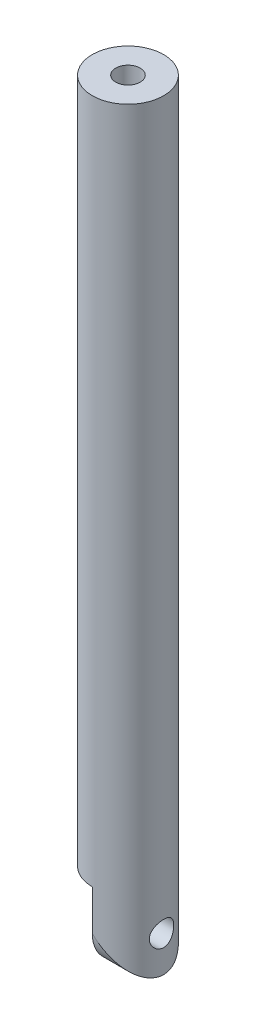
ISO-10303-21;
HEADER;
FILE_DESCRIPTION(('STEP AP214'),'2;1');
FILE_NAME('part.step','',(''),(''),'','','');
FILE_SCHEMA(('AUTOMOTIVE_DESIGN { 1 0 10303 214 1 1 1 1 }'));
ENDSEC;
DATA;
#1=APPLICATION_CONTEXT('core data for automotive mechanical design processes');
#2=APPLICATION_PROTOCOL_DEFINITION('international standard','automotive_design',2000,#1);
#3=PRODUCT_CONTEXT('',#1,'mechanical');
#4=PRODUCT('Part','Part','',(#3));
#5=PRODUCT_RELATED_PRODUCT_CATEGORY('part','',(#4));
#6=PRODUCT_DEFINITION_FORMATION('','',#4);
#7=PRODUCT_DEFINITION_CONTEXT('part definition',#1,'design');
#8=PRODUCT_DEFINITION('design','',#6,#7);
#9=PRODUCT_DEFINITION_SHAPE('','',#8);
#10=(LENGTH_UNIT() NAMED_UNIT(*) SI_UNIT(.MILLI.,.METRE.));
#11=(NAMED_UNIT(*) PLANE_ANGLE_UNIT() SI_UNIT($,.RADIAN.));
#12=(NAMED_UNIT(*) SI_UNIT($,.STERADIAN.) SOLID_ANGLE_UNIT());
#13=UNCERTAINTY_MEASURE_WITH_UNIT(LENGTH_MEASURE(1.E-05),#10,'distance_accuracy_value','');
#14=(GEOMETRIC_REPRESENTATION_CONTEXT(3) GLOBAL_UNCERTAINTY_ASSIGNED_CONTEXT((#13)) GLOBAL_UNIT_ASSIGNED_CONTEXT((#10,
#11,#12)) REPRESENTATION_CONTEXT('',''));
#15=CARTESIAN_POINT('',(0.,0.,0.));
#16=DIRECTION('',(0.,0.,1.));
#17=DIRECTION('',(1.,0.,0.));
#18=AXIS2_PLACEMENT_3D('',#15,#16,#17);
#19=CARTESIAN_POINT('',(0.,101.6,0.));
#20=DIRECTION('',(0.,-1.,0.));
#21=DIRECTION('',(0.,0.,-1.));
#22=AXIS2_PLACEMENT_3D('',#19,#20,#21);
#23=CYLINDRICAL_SURFACE('',#22,9.525);
#24=CARTESIAN_POINT('',(8.94832843552358,-92.075,3.26390000000001));
#25=CARTESIAN_POINT('',(8.94832688524327,-91.8975430675139,3.26390192209394));
#26=CARTESIAN_POINT('',(8.95366487081398,-91.7200993759818,3.24937881737756));
#27=CARTESIAN_POINT('',(8.97432106299892,-91.3704892358746,3.19188040364879));
#28=CARTESIAN_POINT('',(8.98964045290584,-91.1983234155239,3.14890172122584));
#29=CARTESIAN_POINT('',(9.02832486279913,-90.8643944128758,3.03619537112883));
#30=CARTESIAN_POINT('',(9.05167337313668,-90.7026106864325,2.96652255919639));
#31=CARTESIAN_POINT('',(9.10376068028898,-90.3929730808973,2.80259473258308));
#32=CARTESIAN_POINT('',(9.13250076859575,-90.2451225521211,2.70833382598312));
#33=CARTESIAN_POINT('',(9.19346632695508,-89.9614308657868,2.49372776176308));
#34=CARTESIAN_POINT('',(9.22578218560654,-89.8262497591696,2.37253553121975));
#35=CARTESIAN_POINT('',(9.2894963123213,-89.577677052858,2.10931254035652));
#36=CARTESIAN_POINT('',(9.32089442263697,-89.4642891806458,1.96727822255057));
#37=CARTESIAN_POINT('',(9.38028781108821,-89.2594876160868,1.66153687958692));
#38=CARTESIAN_POINT('',(9.40816447644629,-89.1687710541679,1.49733779688749));
#39=CARTESIAN_POINT('',(9.45630446932821,-89.0165108953753,1.15488983926256));
#40=CARTESIAN_POINT('',(9.47656997270046,-88.954958959717,0.976644997337642));
#41=CARTESIAN_POINT('',(9.50656375351611,-88.8650299002555,0.618089881222587));
#42=CARTESIAN_POINT('',(9.51665060185648,-88.835520855785,0.438094063806776));
#43=CARTESIAN_POINT('',(9.5264263788851,-88.8069101874841,0.0754418398923387));
#44=CARTESIAN_POINT('',(9.52611813648513,-88.8078002908545,-0.107213829231289));
#45=CARTESIAN_POINT('',(9.51537827743346,-88.839257247524,-0.461967399913799));
#46=CARTESIAN_POINT('',(9.50536647957956,-88.8685934219484,-0.634189246240994));
#47=CARTESIAN_POINT('',(9.47687658322366,-88.954067126822,-0.971098363536486));
#48=CARTESIAN_POINT('',(9.45839790321792,-89.0102064981205,-1.1357851161415));
#49=CARTESIAN_POINT('',(9.41452915212825,-89.1483789089294,-1.45557161854778));
#50=CARTESIAN_POINT('',(9.38904907975741,-89.2307515296068,-1.61051178683812));
#51=CARTESIAN_POINT('',(9.33381418556181,-89.4187683384939,-1.90472521369059));
#52=CARTESIAN_POINT('',(9.30405812986618,-89.5244192485582,-2.04399392936917));
#53=CARTESIAN_POINT('',(9.24165214073475,-89.7621384531943,-2.31021964329339));
#54=CARTESIAN_POINT('',(9.20893187428512,-89.8952567598196,-2.43622396684902));
#55=CARTESIAN_POINT('',(9.1455152566568,-90.1809977508591,-2.66443976741646));
#56=CARTESIAN_POINT('',(9.11481925602652,-90.3336238001138,-2.76664713114972));
#57=CARTESIAN_POINT('',(9.05852860953376,-90.6572228216171,-2.94578935996434));
#58=CARTESIAN_POINT('',(9.03302233903171,-90.828447820873,-3.02229888341381));
#59=CARTESIAN_POINT('',(8.99101978903449,-91.1824477983105,-3.14506727396317));
#60=CARTESIAN_POINT('',(8.97451947515806,-91.3652175637974,-3.19133968815867));
#61=CARTESIAN_POINT('',(8.95331815763101,-91.7278471032049,-3.25033241443474));
#62=CARTESIAN_POINT('',(8.9480953330939,-91.9074347258327,-3.26453800992766));
#63=CARTESIAN_POINT('',(8.94857749656172,-92.2664654815959,-3.26321823747772));
#64=CARTESIAN_POINT('',(8.95428035234104,-92.4459086360881,-3.24769867061562));
#65=CARTESIAN_POINT('',(8.97544888820054,-92.792623156157,-3.18870666423083));
#66=CARTESIAN_POINT('',(8.9905453557286,-92.9600992005326,-3.14629024401064));
#67=CARTESIAN_POINT('',(9.028387075909,-93.2855149797828,-3.03598878983947));
#68=CARTESIAN_POINT('',(9.05113373217216,-93.4434529583932,-2.96809908193762));
#69=CARTESIAN_POINT('',(9.10264272307873,-93.7510993784021,-2.80623258309399));
#70=CARTESIAN_POINT('',(9.13157905897268,-93.9003631962657,-2.71146762984848));
#71=CARTESIAN_POINT('',(9.19187945874304,-94.181405478673,-2.49942173166563));
#72=CARTESIAN_POINT('',(9.22324427517175,-94.3131784884448,-2.38213379036711));
#73=CARTESIAN_POINT('',(9.28681377160125,-94.5624918663116,-2.12123081014065));
#74=CARTESIAN_POINT('',(9.31897898220896,-94.6789551750727,-1.97657378496872));
#75=CARTESIAN_POINT('',(9.37894776560711,-94.8860367458512,-1.66897628834611));
#76=CARTESIAN_POINT('',(9.40675146541112,-94.9766557605552,-1.50603634955774));
#77=CARTESIAN_POINT('',(9.45475334400422,-95.1286810458529,-1.1671897607157));
#78=CARTESIAN_POINT('',(9.47499716427503,-95.1902632345625,-0.991368852084295));
#79=CARTESIAN_POINT('',(9.50579104295795,-95.2827102574318,-0.631030322969968));
#80=CARTESIAN_POINT('',(9.51634482238003,-95.3135868830153,-0.446516069401626));
#81=CARTESIAN_POINT('',(9.52627292389743,-95.3426382242222,-0.0838531379473618));
#82=CARTESIAN_POINT('',(9.52617449877101,-95.3423552363394,0.094158847940556));
#83=CARTESIAN_POINT('',(9.51612384622613,-95.3129348493672,0.447481015760512));
#84=CARTESIAN_POINT('',(9.5061724960701,-95.2838000191228,0.62279143681711));
#85=CARTESIAN_POINT('',(9.47773864941917,-95.1985420775454,0.96265029518042));
#86=CARTESIAN_POINT('',(9.45940920939859,-95.1429024352027,1.12733374911063));
#87=CARTESIAN_POINT('',(9.41610868497699,-95.0066682671554,1.44508228122619));
#88=CARTESIAN_POINT('',(9.39113637877224,-94.9260691502766,1.59814521541817));
#89=CARTESIAN_POINT('',(9.33591955308115,-94.7386662798983,1.89469165127555));
#90=CARTESIAN_POINT('',(9.30551001660038,-94.6309787709441,2.03758548967328));
#91=CARTESIAN_POINT('',(9.2432124956242,-94.3939345271643,2.30377295987379));
#92=CARTESIAN_POINT('',(9.21132402854465,-94.2645706827231,2.4270601349483));
#93=CARTESIAN_POINT('',(9.14805756227328,-93.9813534588716,2.65581635379314));
#94=CARTESIAN_POINT('',(9.11675732585581,-93.8266994099519,2.76031892263848));
#95=CARTESIAN_POINT('',(9.05983091551393,-93.5010408166231,2.94179821920346));
#96=CARTESIAN_POINT('',(9.03420366651981,-93.3300393789654,3.01878016397191));
#97=CARTESIAN_POINT('',(8.99245579728717,-92.9810131354089,3.14093166273297));
#98=CARTESIAN_POINT('',(8.97610260862492,-92.8032918548108,3.18688555443801));
#99=CARTESIAN_POINT('',(8.95404185946804,-92.4420407597937,3.24836264015055));
#100=CARTESIAN_POINT('',(8.94833003871288,-92.2585132998125,3.2638980123076));
#101=CARTESIAN_POINT('',(8.94832843552358,-92.075,3.26390000000001));
#102=B_SPLINE_CURVE_WITH_KNOTS('',3,(#24,#25,#26,#27,#28,#29,#30,#31,#32,#33,#34,#35,#36,#37,
#38,#39,#40,#41,#42,#43,#44,#45,#46,#47,#48,#49,#50,#51,#52,#53,#54,#55,#56,#57,#58,#59,#60,#61,
#62,#63,#64,#65,#66,#67,#68,#69,#70,#71,#72,#73,#74,#75,#76,#77,#78,#79,#80,#81,#82,#83,#84,#85,
#86,#87,#88,#89,#90,#91,#92,#93,#94,#95,#96,#97,#98,#99,#100,#101),.UNSPECIFIED.,.T.,.F.,(4,2,2,
2,2,2,2,2,2,2,2,2,2,2,2,2,2,2,2,2,2,2,2,2,2,2,2,2,2,2,2,2,2,2,2,2,2,2,4),(0.,0.531690399980153,
1.06344384318031,1.59411035758501,2.12490414988683,2.67564370171508,3.22647736754323,
3.79259727535151,4.35855521966391,4.90379564722724,5.4488876946889,5.97140311390654,
6.49395442475673,7.02356549541314,7.55332969781343,8.10935783821523,8.66548201624341,
9.23040312324098,9.79507095546677,10.3329952775597,10.8708146305208,11.3887251179186,
11.9067306803171,12.4418596914919,12.9771552005516,13.5399140522202,14.1026565124839,
14.6619443715277,15.2210173721222,15.7524312062485,16.2837977298077,16.8058226268596,
17.3279436049525,17.8700187674613,18.4122720743376,18.977312237163,19.5422452291913,
20.0923017720197,20.6421380529247),.UNSPECIFIED.);
#103=CARTESIAN_POINT('',(8.94832843552358,-92.075,3.26390000000001));
#104=VERTEX_POINT('',#103);
#105=EDGE_CURVE('E89',#104,#104,#102,.T.);
#106=ORIENTED_EDGE('',*,*,#105,.T.);
#107=EDGE_LOOP('',(#106));
#108=FACE_BOUND('',#107,.T.);
#109=CARTESIAN_POINT('',(0.,101.6,0.));
#110=DIRECTION('',(0.,1.,0.));
#111=DIRECTION('',(0.,0.,1.));
#112=AXIS2_PLACEMENT_3D('',#109,#110,#111);
#113=CIRCLE('',#112,9.525);
#114=CARTESIAN_POINT('',(0.,101.6,9.525));
#115=VERTEX_POINT('',#114);
#116=EDGE_CURVE('E50',#115,#115,#113,.T.);
#117=ORIENTED_EDGE('',*,*,#116,.F.);
#118=EDGE_LOOP('',(#117));
#119=FACE_BOUND('',#118,.T.);
#120=DIRECTION('',(0.,-1.,0.));
#121=VECTOR('',#120,1.);
#122=CARTESIAN_POINT('',(0.,-81.28,9.52500000000002));
#123=LINE('',#122,#121);
#124=CARTESIAN_POINT('',(0.,-81.28,9.52500000000002));
#125=VERTEX_POINT('',#124);
#126=CARTESIAN_POINT('',(0.,-92.075,9.52500000000002));
#127=VERTEX_POINT('',#126);
#128=EDGE_CURVE('E57',#125,#127,#123,.T.);
#129=ORIENTED_EDGE('',*,*,#128,.T.);
#130=CARTESIAN_POINT('',(0.,-92.075,0.));
#131=DIRECTION('',(-0.707106781186547,-0.707106781186547,0.));
#132=DIRECTION('',(0.707106781186547,-0.707106781186547,0.));
#133=AXIS2_PLACEMENT_3D('',#130,#131,#132);
#134=ELLIPSE('',#133,13.4703841816037,9.52500000000001);
#135=CARTESIAN_POINT('',(0.,-92.075,-9.525));
#136=VERTEX_POINT('',#135);
#137=EDGE_CURVE('E133',#136,#127,#134,.T.);
#138=ORIENTED_EDGE('',*,*,#137,.F.);
#139=DIRECTION('',(0.,1.,0.));
#140=VECTOR('',#139,1.);
#141=CARTESIAN_POINT('',(0.,-81.28,-9.525));
#142=LINE('',#141,#140);
#143=CARTESIAN_POINT('',(0.,-81.28,-9.525));
#144=VERTEX_POINT('',#143);
#145=EDGE_CURVE('E64',#136,#144,#142,.T.);
#146=ORIENTED_EDGE('',*,*,#145,.T.);
#147=CARTESIAN_POINT('',(0.,-81.28,0.));
#148=DIRECTION('',(0.,1.,0.));
#149=DIRECTION('',(0.,0.,1.));
#150=AXIS2_PLACEMENT_3D('',#147,#148,#149);
#151=CIRCLE('',#150,9.525);
#152=EDGE_CURVE('E12',#144,#125,#151,.T.);
#153=ORIENTED_EDGE('',*,*,#152,.T.);
#154=EDGE_LOOP('',(#129,#138,#146,#153));
#155=FACE_BOUND('',#154,.T.);
#156=ADVANCED_FACE('F42',(#108,#119,#155),#23,.T.);
#157=CARTESIAN_POINT('',(0.,0.,0.));
#158=DIRECTION('',(-1.,0.,0.));
#159=DIRECTION('',(0.,0.,1.));
#160=AXIS2_PLACEMENT_3D('',#157,#158,#159);
#161=PLANE('',#160);
#162=CARTESIAN_POINT('',(0.,-92.075,0.));
#163=DIRECTION('',(-1.,0.,0.));
#164=DIRECTION('',(0.,0.,1.));
#165=AXIS2_PLACEMENT_3D('',#162,#163,#164);
#166=CIRCLE('',#165,3.2639);
#167=CARTESIAN_POINT('',(0.,-92.075,3.26390000000001));
#168=VERTEX_POINT('',#167);
#169=EDGE_CURVE('E85',#168,#168,#166,.T.);
#170=ORIENTED_EDGE('',*,*,#169,.F.);
#171=EDGE_LOOP('',(#170));
#172=FACE_BOUND('',#171,.T.);
#173=CARTESIAN_POINT('',(0.,-92.075,0.));
#174=DIRECTION('',(-1.,0.,0.));
#175=DIRECTION('',(0.,0.,1.));
#176=AXIS2_PLACEMENT_3D('',#173,#174,#175);
#177=CIRCLE('',#176,9.52500000000001);
#178=EDGE_CURVE('E100',#136,#127,#177,.T.);
#179=ORIENTED_EDGE('',*,*,#178,.T.);
#180=ORIENTED_EDGE('',*,*,#128,.F.);
#181=DIRECTION('',(0.,0.,1.));
#182=VECTOR('',#181,1.);
#183=CARTESIAN_POINT('',(0.,-81.28,-9.525));
#184=LINE('',#183,#182);
#185=EDGE_CURVE('E134',#144,#125,#184,.T.);
#186=ORIENTED_EDGE('',*,*,#185,.F.);
#187=ORIENTED_EDGE('',*,*,#145,.F.);
#188=EDGE_LOOP('',(#179,#180,#186,#187));
#189=FACE_BOUND('',#188,.T.);
#190=ADVANCED_FACE('F112',(#172,#189),#161,.T.);
#191=CARTESIAN_POINT('',(0.,101.6,0.));
#192=DIRECTION('',(0.,1.,0.));
#193=DIRECTION('',(0.,0.,1.));
#194=AXIS2_PLACEMENT_3D('',#191,#192,#193);
#195=PLANE('',#194);
#196=CARTESIAN_POINT('',(0.,101.6,0.));
#197=DIRECTION('',(0.,1.,0.));
#198=DIRECTION('',(0.,0.,1.));
#199=AXIS2_PLACEMENT_3D('',#196,#197,#198);
#200=CIRCLE('',#199,3.26389999999999);
#201=CARTESIAN_POINT('',(0.,101.6,3.26389999999999));
#202=VERTEX_POINT('',#201);
#203=EDGE_CURVE('E86',#202,#202,#200,.T.);
#204=ORIENTED_EDGE('',*,*,#203,.F.);
#205=EDGE_LOOP('',(#204));
#206=FACE_BOUND('',#205,.T.);
#207=ORIENTED_EDGE('',*,*,#116,.T.);
#208=EDGE_LOOP('',(#207));
#209=FACE_BOUND('',#208,.T.);
#210=ADVANCED_FACE('F115',(#206,#209),#195,.T.);
#211=CARTESIAN_POINT('',(-12.7,-81.28,-9.525));
#212=DIRECTION('',(0.,1.,0.));
#213=DIRECTION('',(0.,0.,1.));
#214=AXIS2_PLACEMENT_3D('',#211,#212,#213);
#215=PLANE('',#214);
#216=ORIENTED_EDGE('',*,*,#185,.T.);
#217=ORIENTED_EDGE('',*,*,#152,.F.);
#218=EDGE_LOOP('',(#216,#217));
#219=FACE_BOUND('',#218,.T.);
#220=ADVANCED_FACE('F110',(#219),#215,.F.);
#221=CARTESIAN_POINT('',(12.7,-92.075,0.));
#222=DIRECTION('',(-1.,0.,0.));
#223=DIRECTION('',(0.,0.,1.));
#224=AXIS2_PLACEMENT_3D('',#221,#222,#223);
#225=CYLINDRICAL_SURFACE('',#224,9.52500000000001);
#226=ORIENTED_EDGE('',*,*,#137,.T.);
#227=ORIENTED_EDGE('',*,*,#178,.F.);
#228=EDGE_LOOP('',(#226,#227));
#229=FACE_BOUND('',#228,.T.);
#230=ADVANCED_FACE('F105',(#229),#225,.T.);
#231=CARTESIAN_POINT('',(0.,-92.075,0.));
#232=DIRECTION('',(-1.,0.,0.));
#233=DIRECTION('',(0.,0.,1.));
#234=AXIS2_PLACEMENT_3D('',#231,#232,#233);
#235=CYLINDRICAL_SURFACE('',#234,3.2639);
#236=ORIENTED_EDGE('',*,*,#169,.T.);
#237=EDGE_LOOP('',(#236));
#238=FACE_BOUND('',#237,.T.);
#239=ORIENTED_EDGE('',*,*,#105,.F.);
#240=EDGE_LOOP('',(#239));
#241=FACE_BOUND('',#240,.T.);
#242=ADVANCED_FACE('F79',(#238,#241),#235,.F.);
#243=CARTESIAN_POINT('',(0.,81.8515,0.));
#244=DIRECTION('',(0.,1.,0.));
#245=DIRECTION('',(0.,0.,1.));
#246=AXIS2_PLACEMENT_3D('',#243,#244,#245);
#247=CONICAL_SURFACE('',#246,3.26389999999999,1.02974425867665);
#248=CARTESIAN_POINT('',(0.,79.8903510255559,0.));
#249=VERTEX_POINT('',#248);
#250=VERTEX_LOOP('',#249);
#251=FACE_BOUND('',#250,.T.);
#252=CARTESIAN_POINT('',(0.,81.8515,0.));
#253=DIRECTION('',(0.,1.,0.));
#254=DIRECTION('',(0.,0.,1.));
#255=AXIS2_PLACEMENT_3D('',#252,#253,#254);
#256=CIRCLE('',#255,3.26389999999999);
#257=CARTESIAN_POINT('',(0.,81.8515,3.26389999999999));
#258=VERTEX_POINT('',#257);
#259=EDGE_CURVE('E83',#258,#258,#256,.T.);
#260=ORIENTED_EDGE('',*,*,#259,.T.);
#261=EDGE_LOOP('',(#260));
#262=FACE_BOUND('',#261,.T.);
#263=ADVANCED_FACE('F75',(#251,#262),#247,.F.);
#264=CARTESIAN_POINT('',(0.,101.6,0.));
#265=DIRECTION('',(0.,1.,0.));
#266=DIRECTION('',(0.,0.,1.));
#267=AXIS2_PLACEMENT_3D('',#264,#265,#266);
#268=CYLINDRICAL_SURFACE('',#267,3.26389999999999);
#269=ORIENTED_EDGE('',*,*,#259,.F.);
#270=EDGE_LOOP('',(#269));
#271=FACE_BOUND('',#270,.T.);
#272=ORIENTED_EDGE('',*,*,#203,.T.);
#273=EDGE_LOOP('',(#272));
#274=FACE_BOUND('',#273,.T.);
#275=ADVANCED_FACE('F78',(#271,#274),#268,.F.);
#276=CLOSED_SHELL('',(#156,#190,#210,#220,#230,#242,#263,#275));
#277=MANIFOLD_SOLID_BREP('B2',#276);
#278=ADVANCED_BREP_SHAPE_REPRESENTATION('',(#18,#277),#14);
#279=SHAPE_DEFINITION_REPRESENTATION(#9,#278);
ENDSEC;
END-ISO-10303-21;
